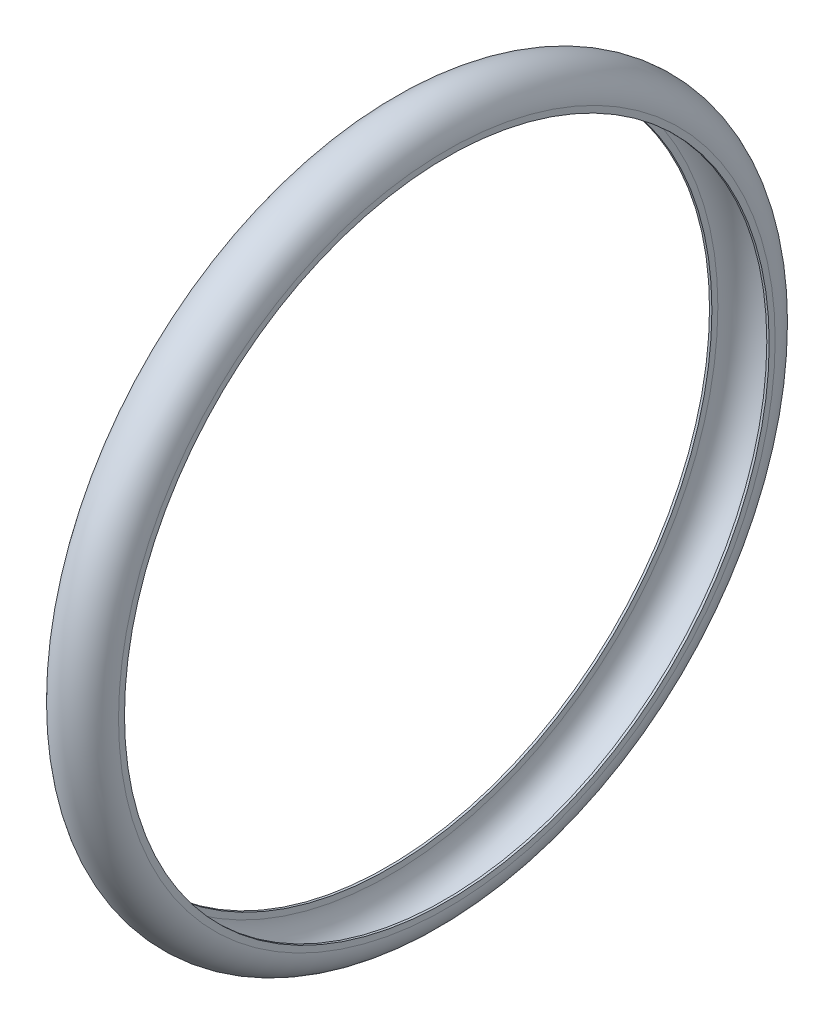
ISO-10303-21;
HEADER;
FILE_DESCRIPTION(('STEP AP214'),'2;1');
FILE_NAME('part.step','',(''),(''),'','','');
FILE_SCHEMA(('AUTOMOTIVE_DESIGN { 1 0 10303 214 1 1 1 1 }'));
ENDSEC;
DATA;
#1=APPLICATION_CONTEXT('core data for automotive mechanical design processes');
#2=APPLICATION_PROTOCOL_DEFINITION('international standard','automotive_design',2000,#1);
#3=PRODUCT_CONTEXT('',#1,'mechanical');
#4=PRODUCT('Part','Part','',(#3));
#5=PRODUCT_RELATED_PRODUCT_CATEGORY('part','',(#4));
#6=PRODUCT_DEFINITION_FORMATION('','',#4);
#7=PRODUCT_DEFINITION_CONTEXT('part definition',#1,'design');
#8=PRODUCT_DEFINITION('design','',#6,#7);
#9=PRODUCT_DEFINITION_SHAPE('','',#8);
#10=(LENGTH_UNIT() NAMED_UNIT(*) SI_UNIT(.MILLI.,.METRE.));
#11=(NAMED_UNIT(*) PLANE_ANGLE_UNIT() SI_UNIT($,.RADIAN.));
#12=(NAMED_UNIT(*) SI_UNIT($,.STERADIAN.) SOLID_ANGLE_UNIT());
#13=UNCERTAINTY_MEASURE_WITH_UNIT(LENGTH_MEASURE(1.E-05),#10,'distance_accuracy_value','');
#14=(GEOMETRIC_REPRESENTATION_CONTEXT(3) GLOBAL_UNCERTAINTY_ASSIGNED_CONTEXT((#13)) GLOBAL_UNIT_ASSIGNED_CONTEXT((#10,
#11,#12)) REPRESENTATION_CONTEXT('',''));
#15=CARTESIAN_POINT('',(0.,0.,0.));
#16=DIRECTION('',(0.,0.,1.));
#17=DIRECTION('',(1.,0.,0.));
#18=AXIS2_PLACEMENT_3D('',#15,#16,#17);
#19=CARTESIAN_POINT('',(50.,0.,0.));
#20=DIRECTION('',(-1.,0.,0.));
#21=DIRECTION('',(0.,0.,1.));
#22=AXIS2_PLACEMENT_3D('',#19,#20,#21);
#23=CYLINDRICAL_SURFACE('',#22,270.);
#24=CARTESIAN_POINT('',(0.,0.,0.));
#25=DIRECTION('',(1.,0.,0.));
#26=DIRECTION('',(0.,0.,-1.));
#27=AXIS2_PLACEMENT_3D('',#24,#25,#26);
#28=CIRCLE('',#27,270.);
#29=CARTESIAN_POINT('',(0.,0.,-270.));
#30=VERTEX_POINT('',#29);
#31=EDGE_CURVE('E62',#30,#30,#28,.T.);
#32=ORIENTED_EDGE('',*,*,#31,.F.);
#33=EDGE_LOOP('',(#32));
#34=FACE_BOUND('',#33,.T.);
#35=CARTESIAN_POINT('',(2.,0.,0.));
#36=DIRECTION('',(1.,0.,0.));
#37=DIRECTION('',(0.,0.,-1.));
#38=AXIS2_PLACEMENT_3D('',#35,#36,#37);
#39=CIRCLE('',#38,270.);
#40=CARTESIAN_POINT('',(2.,0.,-270.));
#41=VERTEX_POINT('',#40);
#42=EDGE_CURVE('E69',#41,#41,#39,.T.);
#43=ORIENTED_EDGE('',*,*,#42,.T.);
#44=EDGE_LOOP('',(#43));
#45=FACE_BOUND('',#44,.T.);
#46=ADVANCED_FACE('F43',(#34,#45),#23,.F.);
#47=CARTESIAN_POINT('',(25.,0.,0.));
#48=DIRECTION('',(1.,0.,0.));
#49=DIRECTION('',(0.,0.,-1.));
#50=AXIS2_PLACEMENT_3D('',#47,#48,#49);
#51=TOROIDAL_SURFACE('',#50,275.,25.);
#52=CARTESIAN_POINT('',(50.,0.,0.));
#53=DIRECTION('',(1.,0.,0.));
#54=DIRECTION('',(0.,0.,-1.));
#55=AXIS2_PLACEMENT_3D('',#52,#53,#54);
#56=CIRCLE('',#55,275.);
#57=CARTESIAN_POINT('',(50.,0.,-275.));
#58=VERTEX_POINT('',#57);
#59=EDGE_CURVE('E52',#58,#58,#56,.T.);
#60=ORIENTED_EDGE('',*,*,#59,.F.);
#61=EDGE_LOOP('',(#60));
#62=FACE_BOUND('',#61,.T.);
#63=CARTESIAN_POINT('',(0.,0.,0.));
#64=DIRECTION('',(1.,0.,0.));
#65=DIRECTION('',(0.,0.,-1.));
#66=AXIS2_PLACEMENT_3D('',#63,#64,#65);
#67=CIRCLE('',#66,275.);
#68=CARTESIAN_POINT('',(0.,0.,-275.));
#69=VERTEX_POINT('',#68);
#70=EDGE_CURVE('E10',#69,#69,#67,.F.);
#71=ORIENTED_EDGE('',*,*,#70,.F.);
#72=EDGE_LOOP('',(#71));
#73=FACE_BOUND('',#72,.T.);
#74=ADVANCED_FACE('F46',(#62,#73),#51,.T.);
#75=CARTESIAN_POINT('',(50.,0.,0.));
#76=DIRECTION('',(1.,0.,0.));
#77=DIRECTION('',(0.,0.,-1.));
#78=AXIS2_PLACEMENT_3D('',#75,#76,#77);
#79=PLANE('',#78);
#80=ORIENTED_EDGE('',*,*,#59,.T.);
#81=EDGE_LOOP('',(#80));
#82=FACE_BOUND('',#81,.T.);
#83=CARTESIAN_POINT('',(50.,0.,0.));
#84=DIRECTION('',(1.,0.,0.));
#85=DIRECTION('',(0.,0.,-1.));
#86=AXIS2_PLACEMENT_3D('',#83,#84,#85);
#87=CIRCLE('',#86,270.);
#88=CARTESIAN_POINT('',(50.,0.,-270.));
#89=VERTEX_POINT('',#88);
#90=EDGE_CURVE('E57',#89,#89,#87,.T.);
#91=ORIENTED_EDGE('',*,*,#90,.F.);
#92=EDGE_LOOP('',(#91));
#93=FACE_BOUND('',#92,.T.);
#94=ADVANCED_FACE('F102',(#82,#93),#79,.T.);
#95=CARTESIAN_POINT('',(0.,0.,0.));
#96=DIRECTION('',(1.,0.,0.));
#97=DIRECTION('',(0.,0.,-1.));
#98=AXIS2_PLACEMENT_3D('',#95,#96,#97);
#99=PLANE('',#98);
#100=ORIENTED_EDGE('',*,*,#70,.T.);
#101=EDGE_LOOP('',(#100));
#102=FACE_BOUND('',#101,.T.);
#103=ORIENTED_EDGE('',*,*,#31,.T.);
#104=EDGE_LOOP('',(#103));
#105=FACE_BOUND('',#104,.T.);
#106=ADVANCED_FACE('F98',(#102,#105),#99,.F.);
#107=CARTESIAN_POINT('',(48.,0.,0.));
#108=DIRECTION('',(1.,0.,0.));
#109=DIRECTION('',(0.,0.,-1.));
#110=AXIS2_PLACEMENT_3D('',#107,#108,#109);
#111=CIRCLE('',#110,270.);
#112=CARTESIAN_POINT('',(48.,0.,-270.));
#113=VERTEX_POINT('',#112);
#114=EDGE_CURVE('E73',#113,#113,#111,.T.);
#115=ORIENTED_EDGE('',*,*,#114,.F.);
#116=EDGE_LOOP('',(#115));
#117=FACE_BOUND('',#116,.T.);
#118=ORIENTED_EDGE('',*,*,#90,.T.);
#119=EDGE_LOOP('',(#118));
#120=FACE_BOUND('',#119,.T.);
#121=ADVANCED_FACE('F95',(#117,#120),#23,.F.);
#122=CARTESIAN_POINT('',(25.,0.,0.));
#123=DIRECTION('',(1.,0.,0.));
#124=DIRECTION('',(0.,0.,-1.));
#125=AXIS2_PLACEMENT_3D('',#122,#123,#124);
#126=TOROIDAL_SURFACE('',#125,275.,23.);
#127=CARTESIAN_POINT('',(48.,0.,0.));
#128=DIRECTION('',(1.,0.,0.));
#129=DIRECTION('',(0.,0.,-1.));
#130=AXIS2_PLACEMENT_3D('',#127,#128,#129);
#131=CIRCLE('',#130,275.);
#132=CARTESIAN_POINT('',(48.,0.,-275.));
#133=VERTEX_POINT('',#132);
#134=EDGE_CURVE('E77',#133,#133,#131,.T.);
#135=ORIENTED_EDGE('',*,*,#134,.T.);
#136=EDGE_LOOP('',(#135));
#137=FACE_BOUND('',#136,.T.);
#138=CARTESIAN_POINT('',(1.99999999999999,0.,0.));
#139=DIRECTION('',(1.,0.,0.));
#140=DIRECTION('',(0.,0.,-1.));
#141=AXIS2_PLACEMENT_3D('',#138,#139,#140);
#142=CIRCLE('',#141,275.);
#143=CARTESIAN_POINT('',(1.99999999999999,0.,-275.));
#144=VERTEX_POINT('',#143);
#145=EDGE_CURVE('E67',#144,#144,#142,.F.);
#146=ORIENTED_EDGE('',*,*,#145,.T.);
#147=EDGE_LOOP('',(#146));
#148=FACE_BOUND('',#147,.T.);
#149=ADVANCED_FACE('F85',(#137,#148),#126,.F.);
#150=CARTESIAN_POINT('',(48.,0.,0.));
#151=DIRECTION('',(1.,0.,0.));
#152=DIRECTION('',(0.,0.,-1.));
#153=AXIS2_PLACEMENT_3D('',#150,#151,#152);
#154=PLANE('',#153);
#155=ORIENTED_EDGE('',*,*,#134,.F.);
#156=EDGE_LOOP('',(#155));
#157=FACE_BOUND('',#156,.T.);
#158=ORIENTED_EDGE('',*,*,#114,.T.);
#159=EDGE_LOOP('',(#158));
#160=FACE_BOUND('',#159,.T.);
#161=ADVANCED_FACE('F88',(#157,#160),#154,.F.);
#162=CARTESIAN_POINT('',(2.,0.,0.));
#163=DIRECTION('',(1.,0.,0.));
#164=DIRECTION('',(0.,0.,-1.));
#165=AXIS2_PLACEMENT_3D('',#162,#163,#164);
#166=PLANE('',#165);
#167=ORIENTED_EDGE('',*,*,#145,.F.);
#168=EDGE_LOOP('',(#167));
#169=FACE_BOUND('',#168,.T.);
#170=ORIENTED_EDGE('',*,*,#42,.F.);
#171=EDGE_LOOP('',(#170));
#172=FACE_BOUND('',#171,.T.);
#173=ADVANCED_FACE('F91',(#169,#172),#166,.T.);
#174=CLOSED_SHELL('',(#46,#74,#94,#106,#121,#149,#161,#173));
#175=MANIFOLD_SOLID_BREP('B2',#174);
#176=ADVANCED_BREP_SHAPE_REPRESENTATION('',(#18,#175),#14);
#177=SHAPE_DEFINITION_REPRESENTATION(#9,#176);
ENDSEC;
END-ISO-10303-21;
